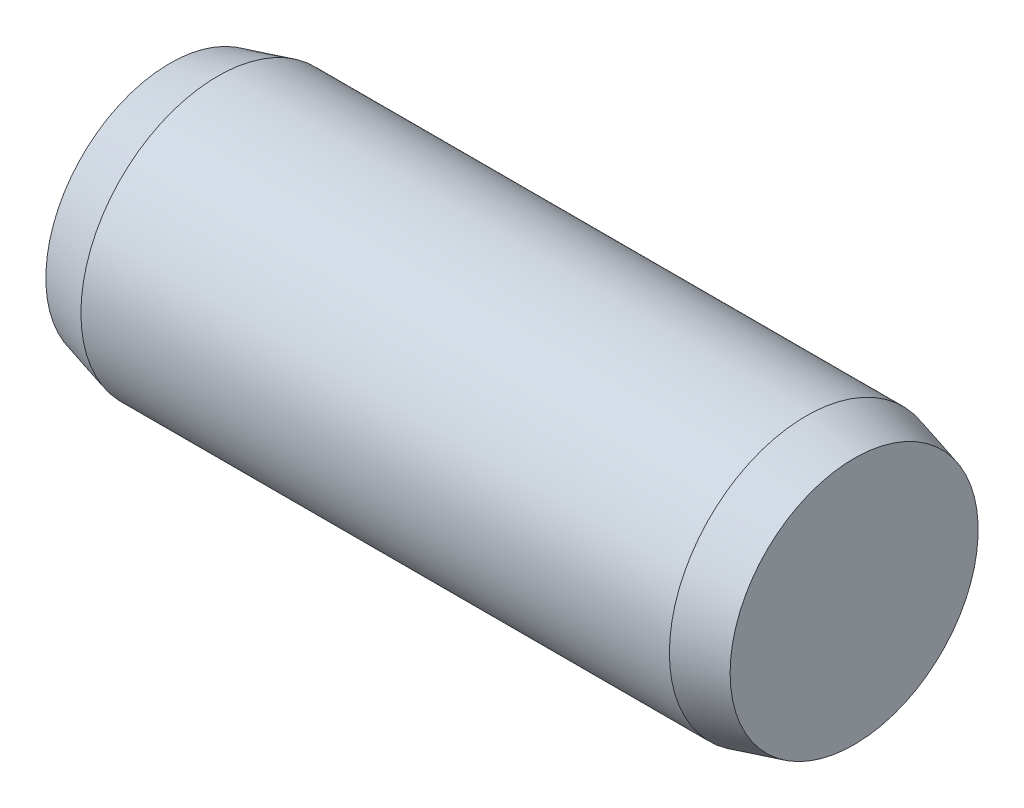
ISO-10303-21;
HEADER;
FILE_DESCRIPTION(('STEP AP214'),'2;1');
FILE_NAME('part.step','',(''),(''),'','','');
FILE_SCHEMA(('AUTOMOTIVE_DESIGN { 1 0 10303 214 1 1 1 1 }'));
ENDSEC;
DATA;
#1=APPLICATION_CONTEXT('core data for automotive mechanical design processes');
#2=APPLICATION_PROTOCOL_DEFINITION('international standard','automotive_design',2000,#1);
#3=PRODUCT_CONTEXT('',#1,'mechanical');
#4=PRODUCT('Part','Part','',(#3));
#5=PRODUCT_RELATED_PRODUCT_CATEGORY('part','',(#4));
#6=PRODUCT_DEFINITION_FORMATION('','',#4);
#7=PRODUCT_DEFINITION_CONTEXT('part definition',#1,'design');
#8=PRODUCT_DEFINITION('design','',#6,#7);
#9=PRODUCT_DEFINITION_SHAPE('','',#8);
#10=(LENGTH_UNIT() NAMED_UNIT(*) SI_UNIT(.MILLI.,.METRE.));
#11=(NAMED_UNIT(*) PLANE_ANGLE_UNIT() SI_UNIT($,.RADIAN.));
#12=(NAMED_UNIT(*) SI_UNIT($,.STERADIAN.) SOLID_ANGLE_UNIT());
#13=UNCERTAINTY_MEASURE_WITH_UNIT(LENGTH_MEASURE(1.E-05),#10,'distance_accuracy_value','');
#14=(GEOMETRIC_REPRESENTATION_CONTEXT(3) GLOBAL_UNCERTAINTY_ASSIGNED_CONTEXT((#13)) GLOBAL_UNIT_ASSIGNED_CONTEXT((#10,
#11,#12)) REPRESENTATION_CONTEXT('',''));
#15=CARTESIAN_POINT('',(0.,0.,0.));
#16=DIRECTION('',(0.,0.,1.));
#17=DIRECTION('',(1.,0.,0.));
#18=AXIS2_PLACEMENT_3D('',#15,#16,#17);
#19=CARTESIAN_POINT('',(5.,0.,0.));
#20=DIRECTION('',(-1.,0.,0.));
#21=DIRECTION('',(0.,0.,1.));
#22=AXIS2_PLACEMENT_3D('',#19,#20,#21);
#23=PLANE('',#22);
#24=CARTESIAN_POINT('',(4.99999999993861,0.,0.));
#25=DIRECTION('',(-1.,0.,0.));
#26=DIRECTION('',(0.,0.,1.));
#27=AXIS2_PLACEMENT_3D('',#24,#25,#26);
#28=CIRCLE('',#27,0.906217782642216);
#29=CARTESIAN_POINT('',(4.99999999993861,0.,0.906217782642216));
#30=VERTEX_POINT('',#29);
#31=EDGE_CURVE('E17',#30,#30,#28,.T.);
#32=ORIENTED_EDGE('',*,*,#31,.F.);
#33=EDGE_LOOP('',(#32));
#34=FACE_BOUND('',#33,.T.);
#35=ADVANCED_FACE('F14',(#34),#23,.F.);
#36=CARTESIAN_POINT('',(0.,0.906217782649107,0.));
#37=DIRECTION('',(1.,0.,0.));
#38=DIRECTION('',(0.,0.,-1.));
#39=AXIS2_PLACEMENT_3D('',#36,#37,#38);
#40=PLANE('',#39);
#41=CARTESIAN_POINT('',(5.6843418860808E-11,0.,0.));
#42=DIRECTION('',(1.,0.,0.));
#43=DIRECTION('',(0.,0.,-1.));
#44=AXIS2_PLACEMENT_3D('',#41,#42,#43);
#45=CIRCLE('',#44,0.906217782642216);
#46=CARTESIAN_POINT('',(5.6843418860808E-11,0.,-0.906217782642216));
#47=VERTEX_POINT('',#46);
#48=EDGE_CURVE('E26',#47,#47,#45,.T.);
#49=ORIENTED_EDGE('',*,*,#48,.F.);
#50=EDGE_LOOP('',(#49));
#51=FACE_BOUND('',#50,.T.);
#52=ADVANCED_FACE('F37',(#51),#40,.F.);
#53=CARTESIAN_POINT('',(4.64999999996962,0.,0.));
#54=DIRECTION('',(-1.,0.,0.));
#55=DIRECTION('',(0.,0.,1.));
#56=AXIS2_PLACEMENT_3D('',#53,#54,#55);
#57=CONICAL_SURFACE('',#56,1.00000000000477,0.261799387852401);
#58=CARTESIAN_POINT('',(4.65,0.,0.));
#59=DIRECTION('',(-1.,0.,0.));
#60=DIRECTION('',(0.,0.,1.));
#61=AXIS2_PLACEMENT_3D('',#58,#59,#60);
#62=CIRCLE('',#61,0.999999999999998);
#63=CARTESIAN_POINT('',(4.65,0.,0.999999999999998));
#64=VERTEX_POINT('',#63);
#65=EDGE_CURVE('E21',#64,#64,#62,.T.);
#66=ORIENTED_EDGE('',*,*,#65,.F.);
#67=EDGE_LOOP('',(#66));
#68=FACE_BOUND('',#67,.T.);
#69=ORIENTED_EDGE('',*,*,#31,.T.);
#70=EDGE_LOOP('',(#69));
#71=FACE_BOUND('',#70,.T.);
#72=ADVANCED_FACE('F34',(#68,#71),#57,.T.);
#73=CARTESIAN_POINT('',(0.35000000002583,0.,0.));
#74=DIRECTION('',(1.,0.,0.));
#75=DIRECTION('',(0.,0.,-1.));
#76=AXIS2_PLACEMENT_3D('',#73,#74,#75);
#77=CONICAL_SURFACE('',#76,0.999999999976353,0.261799387776636);
#78=CARTESIAN_POINT('',(0.35,0.,0.));
#79=DIRECTION('',(-1.,0.,0.));
#80=DIRECTION('',(0.,0.,1.));
#81=AXIS2_PLACEMENT_3D('',#78,#79,#80);
#82=CIRCLE('',#81,0.999999999999998);
#83=CARTESIAN_POINT('',(0.35,0.,0.999999999999998));
#84=VERTEX_POINT('',#83);
#85=EDGE_CURVE('E10',#84,#84,#82,.F.);
#86=ORIENTED_EDGE('',*,*,#85,.F.);
#87=EDGE_LOOP('',(#86));
#88=FACE_BOUND('',#87,.T.);
#89=ORIENTED_EDGE('',*,*,#48,.T.);
#90=EDGE_LOOP('',(#89));
#91=FACE_BOUND('',#90,.T.);
#92=ADVANCED_FACE('F45',(#88,#91),#77,.T.);
#93=CARTESIAN_POINT('',(-6.35,0.,0.));
#94=DIRECTION('',(-1.,0.,0.));
#95=DIRECTION('',(0.,0.,1.));
#96=AXIS2_PLACEMENT_3D('',#93,#94,#95);
#97=CYLINDRICAL_SURFACE('',#96,0.999999999999998);
#98=ORIENTED_EDGE('',*,*,#85,.T.);
#99=EDGE_LOOP('',(#98));
#100=FACE_BOUND('',#99,.T.);
#101=ORIENTED_EDGE('',*,*,#65,.T.);
#102=EDGE_LOOP('',(#101));
#103=FACE_BOUND('',#102,.T.);
#104=ADVANCED_FACE('F43',(#100,#103),#97,.T.);
#105=CLOSED_SHELL('',(#35,#52,#72,#92,#104));
#106=MANIFOLD_SOLID_BREP('B1',#105);
#107=ADVANCED_BREP_SHAPE_REPRESENTATION('',(#18,#106),#14);
#108=SHAPE_DEFINITION_REPRESENTATION(#9,#107);
ENDSEC;
END-ISO-10303-21;
